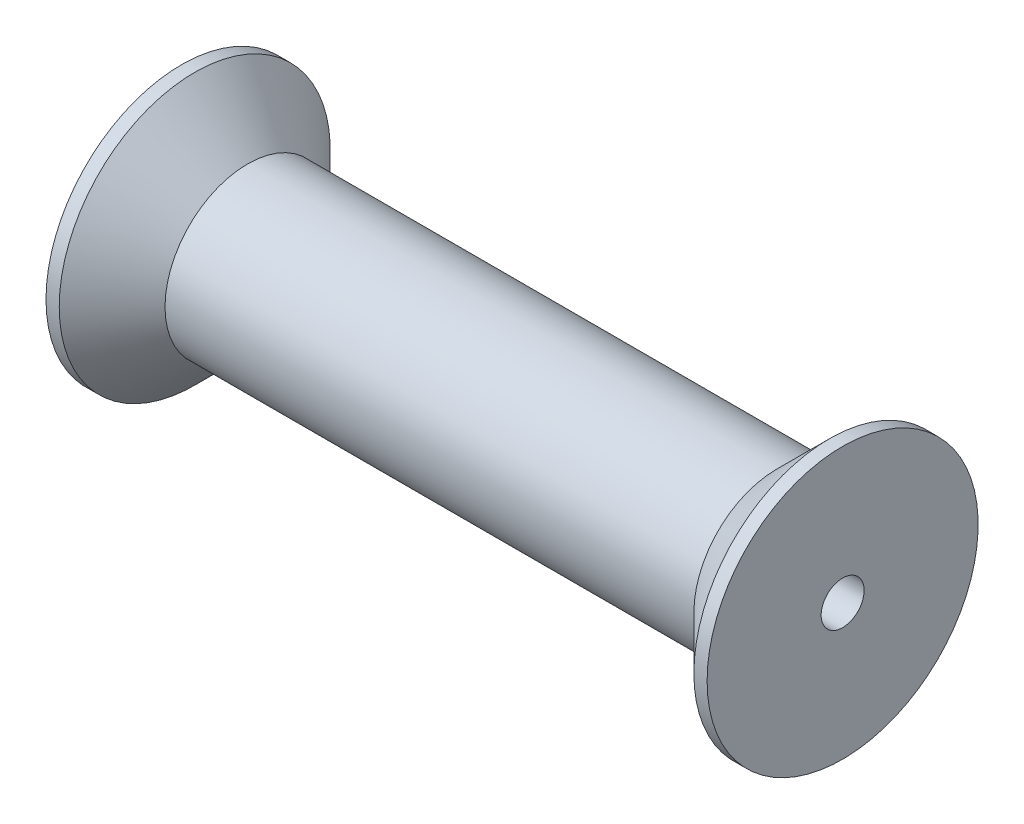
ISO-10303-21;
HEADER;
FILE_DESCRIPTION(('STEP AP214'),'2;1');
FILE_NAME('part.step','',(''),(''),'','','');
FILE_SCHEMA(('AUTOMOTIVE_DESIGN { 1 0 10303 214 1 1 1 1 }'));
ENDSEC;
DATA;
#1=APPLICATION_CONTEXT('core data for automotive mechanical design processes');
#2=APPLICATION_PROTOCOL_DEFINITION('international standard','automotive_design',2000,#1);
#3=PRODUCT_CONTEXT('',#1,'mechanical');
#4=PRODUCT('Part','Part','',(#3));
#5=PRODUCT_RELATED_PRODUCT_CATEGORY('part','',(#4));
#6=PRODUCT_DEFINITION_FORMATION('','',#4);
#7=PRODUCT_DEFINITION_CONTEXT('part definition',#1,'design');
#8=PRODUCT_DEFINITION('design','',#6,#7);
#9=PRODUCT_DEFINITION_SHAPE('','',#8);
#10=(LENGTH_UNIT() NAMED_UNIT(*) SI_UNIT(.MILLI.,.METRE.));
#11=(NAMED_UNIT(*) PLANE_ANGLE_UNIT() SI_UNIT($,.RADIAN.));
#12=(NAMED_UNIT(*) SI_UNIT($,.STERADIAN.) SOLID_ANGLE_UNIT());
#13=UNCERTAINTY_MEASURE_WITH_UNIT(LENGTH_MEASURE(1.E-05),#10,'distance_accuracy_value','');
#14=(GEOMETRIC_REPRESENTATION_CONTEXT(3) GLOBAL_UNCERTAINTY_ASSIGNED_CONTEXT((#13)) GLOBAL_UNIT_ASSIGNED_CONTEXT((#10,
#11,#12)) REPRESENTATION_CONTEXT('',''));
#15=CARTESIAN_POINT('',(0.,0.,0.));
#16=DIRECTION('',(0.,0.,1.));
#17=DIRECTION('',(1.,0.,0.));
#18=AXIS2_PLACEMENT_3D('',#15,#16,#17);
#19=CARTESIAN_POINT('',(0.,3.25,0.));
#20=DIRECTION('',(1.,0.,0.));
#21=DIRECTION('',(0.,0.,-1.));
#22=AXIS2_PLACEMENT_3D('',#19,#20,#21);
#23=PLANE('',#22);
#24=CARTESIAN_POINT('',(0.,0.,0.));
#25=DIRECTION('',(-1.,0.,0.));
#26=DIRECTION('',(0.,0.,1.));
#27=AXIS2_PLACEMENT_3D('',#24,#25,#26);
#28=CIRCLE('',#27,3.25);
#29=CARTESIAN_POINT('',(0.,0.,3.25));
#30=VERTEX_POINT('',#29);
#31=EDGE_CURVE('E10',#30,#30,#28,.T.);
#32=ORIENTED_EDGE('',*,*,#31,.F.);
#33=EDGE_LOOP('',(#32));
#34=FACE_BOUND('',#33,.T.);
#35=CARTESIAN_POINT('',(0.,0.,0.));
#36=DIRECTION('',(-1.,0.,0.));
#37=DIRECTION('',(0.,0.,1.));
#38=AXIS2_PLACEMENT_3D('',#35,#36,#37);
#39=CIRCLE('',#38,20.5);
#40=CARTESIAN_POINT('',(0.,0.,20.5));
#41=VERTEX_POINT('',#40);
#42=EDGE_CURVE('E70',#41,#41,#39,.T.);
#43=ORIENTED_EDGE('',*,*,#42,.T.);
#44=EDGE_LOOP('',(#43));
#45=FACE_BOUND('',#44,.T.);
#46=ADVANCED_FACE('F30',(#34,#45),#23,.F.);
#47=CARTESIAN_POINT('',(0.,0.,0.));
#48=DIRECTION('',(-1.,0.,0.));
#49=DIRECTION('',(0.,0.,1.));
#50=AXIS2_PLACEMENT_3D('',#47,#48,#49);
#51=CYLINDRICAL_SURFACE('',#50,3.25);
#52=CARTESIAN_POINT('',(10.,0.,0.));
#53=DIRECTION('',(-1.,0.,0.));
#54=DIRECTION('',(0.,0.,1.));
#55=AXIS2_PLACEMENT_3D('',#52,#53,#54);
#56=CIRCLE('',#55,3.25);
#57=CARTESIAN_POINT('',(10.,0.,3.25));
#58=VERTEX_POINT('',#57);
#59=EDGE_CURVE('E36',#58,#58,#56,.T.);
#60=ORIENTED_EDGE('',*,*,#59,.F.);
#61=EDGE_LOOP('',(#60));
#62=FACE_BOUND('',#61,.T.);
#63=ORIENTED_EDGE('',*,*,#31,.T.);
#64=EDGE_LOOP('',(#63));
#65=FACE_BOUND('',#64,.T.);
#66=ADVANCED_FACE('F131',(#62,#65),#51,.F.);
#67=CARTESIAN_POINT('',(31.459292143521,0.,0.));
#68=DIRECTION('',(-1.,0.,0.));
#69=DIRECTION('',(0.,0.,1.));
#70=AXIS2_PLACEMENT_3D('',#67,#68,#69);
#71=DEGENERATE_TOROIDAL_SURFACE('',#70,33.9185842870418,42.9185842870418,.F.);
#72=CARTESIAN_POINT('',(31.459292143521,0.,0.));
#73=DIRECTION('',(-1.,0.,0.));
#74=DIRECTION('',(0.,0.,1.));
#75=AXIS2_PLACEMENT_3D('',#72,#73,#74);
#76=CIRCLE('',#75,8.99999999999999);
#77=CARTESIAN_POINT('',(31.459292143521,0.,8.99999999999999));
#78=VERTEX_POINT('',#77);
#79=EDGE_CURVE('E40',#78,#78,#76,.T.);
#80=ORIENTED_EDGE('',*,*,#79,.F.);
#81=EDGE_LOOP('',(#80));
#82=FACE_BOUND('',#81,.T.);
#83=ORIENTED_EDGE('',*,*,#59,.T.);
#84=EDGE_LOOP('',(#83));
#85=FACE_BOUND('',#84,.T.);
#86=ADVANCED_FACE('F126',(#82,#85),#71,.T.);
#87=CARTESIAN_POINT('',(0.,0.,0.));
#88=DIRECTION('',(-1.,0.,0.));
#89=DIRECTION('',(0.,0.,1.));
#90=AXIS2_PLACEMENT_3D('',#87,#88,#89);
#91=CYLINDRICAL_SURFACE('',#90,9.);
#92=CARTESIAN_POINT('',(68.540707856479,0.,0.));
#93=DIRECTION('',(-1.,0.,0.));
#94=DIRECTION('',(0.,0.,1.));
#95=AXIS2_PLACEMENT_3D('',#92,#93,#94);
#96=CIRCLE('',#95,9.);
#97=CARTESIAN_POINT('',(68.540707856479,0.,9.));
#98=VERTEX_POINT('',#97);
#99=EDGE_CURVE('E44',#98,#98,#96,.T.);
#100=ORIENTED_EDGE('',*,*,#99,.F.);
#101=EDGE_LOOP('',(#100));
#102=FACE_BOUND('',#101,.T.);
#103=ORIENTED_EDGE('',*,*,#79,.T.);
#104=EDGE_LOOP('',(#103));
#105=FACE_BOUND('',#104,.T.);
#106=ADVANCED_FACE('F120',(#102,#105),#91,.F.);
#107=CARTESIAN_POINT('',(68.540707856479,0.,0.));
#108=DIRECTION('',(-1.,0.,0.));
#109=DIRECTION('',(0.,0.,1.));
#110=AXIS2_PLACEMENT_3D('',#107,#108,#109);
#111=DEGENERATE_TOROIDAL_SURFACE('',#110,33.9185842870418,42.9185842870418,.F.);
#112=CARTESIAN_POINT('',(90.,0.,0.));
#113=DIRECTION('',(-1.,0.,0.));
#114=DIRECTION('',(0.,0.,1.));
#115=AXIS2_PLACEMENT_3D('',#112,#113,#114);
#116=CIRCLE('',#115,3.25);
#117=CARTESIAN_POINT('',(90.,0.,3.25));
#118=VERTEX_POINT('',#117);
#119=EDGE_CURVE('E49',#118,#118,#116,.T.);
#120=ORIENTED_EDGE('',*,*,#119,.F.);
#121=EDGE_LOOP('',(#120));
#122=FACE_BOUND('',#121,.T.);
#123=ORIENTED_EDGE('',*,*,#99,.T.);
#124=EDGE_LOOP('',(#123));
#125=FACE_BOUND('',#124,.T.);
#126=ADVANCED_FACE('F114',(#122,#125),#111,.T.);
#127=CARTESIAN_POINT('',(0.,0.,0.));
#128=DIRECTION('',(-1.,0.,0.));
#129=DIRECTION('',(0.,0.,1.));
#130=AXIS2_PLACEMENT_3D('',#127,#128,#129);
#131=CYLINDRICAL_SURFACE('',#130,3.25);
#132=CARTESIAN_POINT('',(100.,0.,0.));
#133=DIRECTION('',(-1.,0.,0.));
#134=DIRECTION('',(0.,0.,1.));
#135=AXIS2_PLACEMENT_3D('',#132,#133,#134);
#136=CIRCLE('',#135,3.25);
#137=CARTESIAN_POINT('',(100.,0.,3.25));
#138=VERTEX_POINT('',#137);
#139=EDGE_CURVE('E52',#138,#138,#136,.T.);
#140=ORIENTED_EDGE('',*,*,#139,.F.);
#141=EDGE_LOOP('',(#140));
#142=FACE_BOUND('',#141,.T.);
#143=ORIENTED_EDGE('',*,*,#119,.T.);
#144=EDGE_LOOP('',(#143));
#145=FACE_BOUND('',#144,.T.);
#146=ADVANCED_FACE('F108',(#142,#145),#131,.F.);
#147=CARTESIAN_POINT('',(100.,20.5,0.));
#148=DIRECTION('',(-1.,0.,0.));
#149=DIRECTION('',(0.,0.,1.));
#150=AXIS2_PLACEMENT_3D('',#147,#148,#149);
#151=PLANE('',#150);
#152=CARTESIAN_POINT('',(100.,0.,0.));
#153=DIRECTION('',(-1.,0.,0.));
#154=DIRECTION('',(0.,0.,1.));
#155=AXIS2_PLACEMENT_3D('',#152,#153,#154);
#156=CIRCLE('',#155,20.5);
#157=CARTESIAN_POINT('',(100.,0.,20.5));
#158=VERTEX_POINT('',#157);
#159=EDGE_CURVE('E55',#158,#158,#156,.T.);
#160=ORIENTED_EDGE('',*,*,#159,.F.);
#161=EDGE_LOOP('',(#160));
#162=FACE_BOUND('',#161,.T.);
#163=ORIENTED_EDGE('',*,*,#139,.T.);
#164=EDGE_LOOP('',(#163));
#165=FACE_BOUND('',#164,.T.);
#166=ADVANCED_FACE('F102',(#162,#165),#151,.F.);
#167=CARTESIAN_POINT('',(0.,0.,0.));
#168=DIRECTION('',(-1.,0.,0.));
#169=DIRECTION('',(0.,0.,1.));
#170=AXIS2_PLACEMENT_3D('',#167,#168,#169);
#171=CYLINDRICAL_SURFACE('',#170,20.5);
#172=CARTESIAN_POINT('',(98.,0.,0.));
#173=DIRECTION('',(-1.,0.,0.));
#174=DIRECTION('',(0.,0.,1.));
#175=AXIS2_PLACEMENT_3D('',#172,#173,#174);
#176=CIRCLE('',#175,20.5);
#177=CARTESIAN_POINT('',(98.,0.,20.5));
#178=VERTEX_POINT('',#177);
#179=EDGE_CURVE('E58',#178,#178,#176,.T.);
#180=ORIENTED_EDGE('',*,*,#179,.F.);
#181=EDGE_LOOP('',(#180));
#182=FACE_BOUND('',#181,.T.);
#183=ORIENTED_EDGE('',*,*,#159,.T.);
#184=EDGE_LOOP('',(#183));
#185=FACE_BOUND('',#184,.T.);
#186=ADVANCED_FACE('F96',(#182,#185),#171,.T.);
#187=CARTESIAN_POINT('',(98.,0.,0.));
#188=DIRECTION('',(1.,0.,0.));
#189=DIRECTION('',(0.,0.,-1.));
#190=AXIS2_PLACEMENT_3D('',#187,#188,#189);
#191=CONICAL_SURFACE('',#190,20.5,0.78539816339745);
#192=CARTESIAN_POINT('',(90.,0.,0.));
#193=DIRECTION('',(-1.,0.,0.));
#194=DIRECTION('',(0.,0.,1.));
#195=AXIS2_PLACEMENT_3D('',#192,#193,#194);
#196=CIRCLE('',#195,12.5);
#197=CARTESIAN_POINT('',(90.,0.,12.5));
#198=VERTEX_POINT('',#197);
#199=EDGE_CURVE('E61',#198,#198,#196,.T.);
#200=ORIENTED_EDGE('',*,*,#199,.F.);
#201=EDGE_LOOP('',(#200));
#202=FACE_BOUND('',#201,.T.);
#203=ORIENTED_EDGE('',*,*,#179,.T.);
#204=EDGE_LOOP('',(#203));
#205=FACE_BOUND('',#204,.T.);
#206=ADVANCED_FACE('F90',(#202,#205),#191,.T.);
#207=CARTESIAN_POINT('',(0.,0.,0.));
#208=DIRECTION('',(-1.,0.,0.));
#209=DIRECTION('',(0.,0.,1.));
#210=AXIS2_PLACEMENT_3D('',#207,#208,#209);
#211=CYLINDRICAL_SURFACE('',#210,12.5);
#212=CARTESIAN_POINT('',(9.99999999999998,0.,0.));
#213=DIRECTION('',(-1.,0.,0.));
#214=DIRECTION('',(0.,0.,1.));
#215=AXIS2_PLACEMENT_3D('',#212,#213,#214);
#216=CIRCLE('',#215,12.5);
#217=CARTESIAN_POINT('',(9.99999999999998,0.,12.5));
#218=VERTEX_POINT('',#217);
#219=EDGE_CURVE('E64',#218,#218,#216,.T.);
#220=ORIENTED_EDGE('',*,*,#219,.F.);
#221=EDGE_LOOP('',(#220));
#222=FACE_BOUND('',#221,.T.);
#223=ORIENTED_EDGE('',*,*,#199,.T.);
#224=EDGE_LOOP('',(#223));
#225=FACE_BOUND('',#224,.T.);
#226=ADVANCED_FACE('F84',(#222,#225),#211,.T.);
#227=CARTESIAN_POINT('',(9.99999999999998,0.,0.));
#228=DIRECTION('',(-1.,0.,0.));
#229=DIRECTION('',(0.,0.,1.));
#230=AXIS2_PLACEMENT_3D('',#227,#228,#229);
#231=CONICAL_SURFACE('',#230,12.5,0.78539816339745);
#232=CARTESIAN_POINT('',(2.,0.,0.));
#233=DIRECTION('',(-1.,0.,0.));
#234=DIRECTION('',(0.,0.,1.));
#235=AXIS2_PLACEMENT_3D('',#232,#233,#234);
#236=CIRCLE('',#235,20.5);
#237=CARTESIAN_POINT('',(2.,0.,20.5));
#238=VERTEX_POINT('',#237);
#239=EDGE_CURVE('E67',#238,#238,#236,.T.);
#240=ORIENTED_EDGE('',*,*,#239,.F.);
#241=EDGE_LOOP('',(#240));
#242=FACE_BOUND('',#241,.T.);
#243=ORIENTED_EDGE('',*,*,#219,.T.);
#244=EDGE_LOOP('',(#243));
#245=FACE_BOUND('',#244,.T.);
#246=ADVANCED_FACE('F78',(#242,#245),#231,.T.);
#247=CARTESIAN_POINT('',(0.,0.,0.));
#248=DIRECTION('',(-1.,0.,0.));
#249=DIRECTION('',(0.,0.,1.));
#250=AXIS2_PLACEMENT_3D('',#247,#248,#249);
#251=CYLINDRICAL_SURFACE('',#250,20.5);
#252=ORIENTED_EDGE('',*,*,#42,.F.);
#253=EDGE_LOOP('',(#252));
#254=FACE_BOUND('',#253,.T.);
#255=ORIENTED_EDGE('',*,*,#239,.T.);
#256=EDGE_LOOP('',(#255));
#257=FACE_BOUND('',#256,.T.);
#258=ADVANCED_FACE('F75',(#254,#257),#251,.T.);
#259=CLOSED_SHELL('',(#46,#66,#86,#106,#126,#146,#166,#186,#206,#226,#246,#258));
#260=MANIFOLD_SOLID_BREP('B2',#259);
#261=ADVANCED_BREP_SHAPE_REPRESENTATION('',(#18,#260),#14);
#262=SHAPE_DEFINITION_REPRESENTATION(#9,#261);
ENDSEC;
END-ISO-10303-21;
